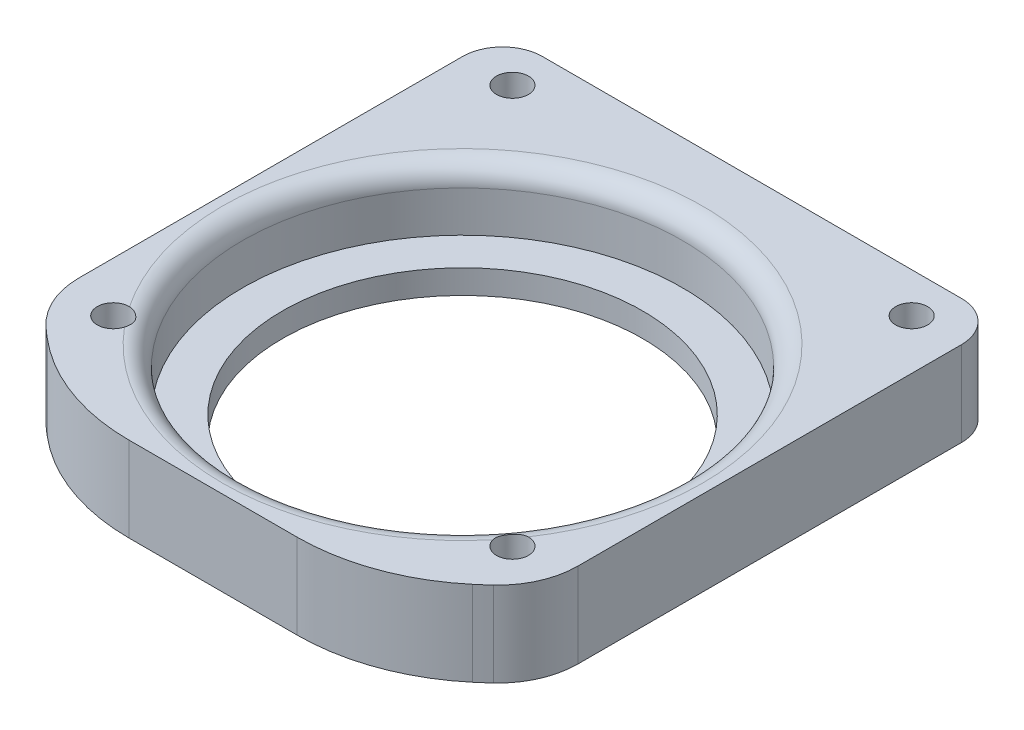
ISO-10303-21;
HEADER;
FILE_DESCRIPTION(('STEP AP214'),'2;1');
FILE_NAME('part.step','',(''),(''),'','','');
FILE_SCHEMA(('AUTOMOTIVE_DESIGN { 1 0 10303 214 1 1 1 1 }'));
ENDSEC;
DATA;
#1=APPLICATION_CONTEXT('core data for automotive mechanical design processes');
#2=APPLICATION_PROTOCOL_DEFINITION('international standard','automotive_design',2000,#1);
#3=PRODUCT_CONTEXT('',#1,'mechanical');
#4=PRODUCT('Part','Part','',(#3));
#5=PRODUCT_RELATED_PRODUCT_CATEGORY('part','',(#4));
#6=PRODUCT_DEFINITION_FORMATION('','',#4);
#7=PRODUCT_DEFINITION_CONTEXT('part definition',#1,'design');
#8=PRODUCT_DEFINITION('design','',#6,#7);
#9=PRODUCT_DEFINITION_SHAPE('','',#8);
#10=(LENGTH_UNIT() NAMED_UNIT(*) SI_UNIT(.MILLI.,.METRE.));
#11=(NAMED_UNIT(*) PLANE_ANGLE_UNIT() SI_UNIT($,.RADIAN.));
#12=(NAMED_UNIT(*) SI_UNIT($,.STERADIAN.) SOLID_ANGLE_UNIT());
#13=UNCERTAINTY_MEASURE_WITH_UNIT(LENGTH_MEASURE(1.E-05),#10,'distance_accuracy_value','');
#14=(GEOMETRIC_REPRESENTATION_CONTEXT(3) GLOBAL_UNCERTAINTY_ASSIGNED_CONTEXT((#13)) GLOBAL_UNIT_ASSIGNED_CONTEXT((#10,
#11,#12)) REPRESENTATION_CONTEXT('',''));
#15=CARTESIAN_POINT('',(0.,0.,0.));
#16=DIRECTION('',(0.,0.,1.));
#17=DIRECTION('',(1.,0.,0.));
#18=AXIS2_PLACEMENT_3D('',#15,#16,#17);
#19=CARTESIAN_POINT('',(0.,8.5,0.));
#20=DIRECTION('',(0.,1.,0.));
#21=DIRECTION('',(0.,0.,1.));
#22=AXIS2_PLACEMENT_3D('',#19,#20,#21);
#23=PLANE('',#22);
#24=CARTESIAN_POINT('',(20.0000000000001,8.5,15.0000000000005));
#25=DIRECTION('',(0.,1.,0.));
#26=DIRECTION('',(0.,0.,1.));
#27=AXIS2_PLACEMENT_3D('',#24,#25,#26);
#28=CIRCLE('',#27,1.6);
#29=CARTESIAN_POINT('',(18.45609648559,8.5,15.41995468588));
#30=VERTEX_POINT('',#29);
#31=CARTESIAN_POINT('',(19.9708635144096,8.5,13.4002653141205));
#32=VERTEX_POINT('',#31);
#33=EDGE_CURVE('E183',#30,#32,#28,.T.);
#34=ORIENTED_EDGE('',*,*,#33,.F.);
#35=CARTESIAN_POINT('',(0.,8.5,0.));
#36=DIRECTION('',(0.,1.,0.));
#37=DIRECTION('',(0.,0.,1.));
#38=AXIS2_PLACEMENT_3D('',#35,#36,#37);
#39=CIRCLE('',#38,24.05);
#40=CARTESIAN_POINT('',(-18.45609648559,8.5,15.41995468588));
#41=VERTEX_POINT('',#40);
#42=EDGE_CURVE('E193',#30,#41,#39,.F.);
#43=ORIENTED_EDGE('',*,*,#42,.T.);
#44=CARTESIAN_POINT('',(-20.,8.5,15.));
#45=DIRECTION('',(0.,1.,0.));
#46=DIRECTION('',(0.,0.,1.));
#47=AXIS2_PLACEMENT_3D('',#44,#45,#46);
#48=CIRCLE('',#47,1.6);
#49=CARTESIAN_POINT('',(-19.97086351441,8.5,13.40026531412));
#50=VERTEX_POINT('',#49);
#51=EDGE_CURVE('E664',#50,#41,#48,.T.);
#52=ORIENTED_EDGE('',*,*,#51,.F.);
#53=EDGE_CURVE('E195',#50,#32,#39,.F.);
#54=ORIENTED_EDGE('',*,*,#53,.T.);
#55=EDGE_LOOP('',(#34,#43,#52,#54));
#56=FACE_BOUND('',#55,.T.);
#57=CARTESIAN_POINT('',(-19.9999999999996,8.5,-24.9999999999998));
#58=DIRECTION('',(0.,1.,0.));
#59=DIRECTION('',(0.,0.,1.));
#60=AXIS2_PLACEMENT_3D('',#57,#58,#59);
#61=CIRCLE('',#60,1.6);
#62=CARTESIAN_POINT('',(-19.9999999999996,8.5,-23.3999999999998));
#63=VERTEX_POINT('',#62);
#64=EDGE_CURVE('E710',#63,#63,#61,.T.);
#65=ORIENTED_EDGE('',*,*,#64,.F.);
#66=EDGE_LOOP('',(#65));
#67=FACE_BOUND('',#66,.T.);
#68=CARTESIAN_POINT('',(20.0000000000004,8.5,-24.9999999999996));
#69=DIRECTION('',(0.,1.,0.));
#70=DIRECTION('',(0.,0.,1.));
#71=AXIS2_PLACEMENT_3D('',#68,#69,#70);
#72=CIRCLE('',#71,1.6);
#73=CARTESIAN_POINT('',(20.0000000000004,8.5,-23.3999999999996));
#74=VERTEX_POINT('',#73);
#75=EDGE_CURVE('E719',#74,#74,#72,.T.);
#76=ORIENTED_EDGE('',*,*,#75,.F.);
#77=EDGE_LOOP('',(#76));
#78=FACE_BOUND('',#77,.T.);
#79=DIRECTION('',(-1.,0.,0.));
#80=VECTOR('',#79,1.);
#81=CARTESIAN_POINT('',(0.,8.5,25.));
#82=LINE('',#81,#80);
#83=CARTESIAN_POINT('',(8.42485824974702,8.5,25.));
#84=VERTEX_POINT('',#83);
#85=CARTESIAN_POINT('',(-8.42485824974702,8.5,25.));
#86=VERTEX_POINT('',#85);
#87=EDGE_CURVE('E265',#84,#86,#82,.T.);
#88=ORIENTED_EDGE('',*,*,#87,.F.);
#89=CARTESIAN_POINT('',(8.42485824974702,8.5,5.));
#90=DIRECTION('',(0.,1.,0.));
#91=DIRECTION('',(0.,0.,1.));
#92=AXIS2_PLACEMENT_3D('',#89,#90,#91);
#93=CIRCLE('',#92,20.);
#94=CARTESIAN_POINT('',(21.310978549613,8.5,20.2953556224556));
#95=VERTEX_POINT('',#94);
#96=EDGE_CURVE('E86',#84,#95,#93,.T.);
#97=ORIENTED_EDGE('',*,*,#96,.T.);
#98=CARTESIAN_POINT('',(0.,8.5,-5.));
#99=DIRECTION('',(0.,1.,0.));
#100=DIRECTION('',(0.,0.,1.));
#101=AXIS2_PLACEMENT_3D('',#98,#99,#100);
#102=CIRCLE('',#101,33.0758646570057);
#103=CARTESIAN_POINT('',(22.4235417944802,8.5,19.3145552334349));
#104=VERTEX_POINT('',#103);
#105=EDGE_CURVE('E263',#95,#104,#102,.T.);
#106=ORIENTED_EDGE('',*,*,#105,.T.);
#107=CARTESIAN_POINT('',(17.,8.5,13.4336374136107));
#108=DIRECTION('',(0.,1.,0.));
#109=DIRECTION('',(0.,0.,1.));
#110=AXIS2_PLACEMENT_3D('',#107,#108,#109);
#111=CIRCLE('',#110,8.);
#112=CARTESIAN_POINT('',(25.,8.5,13.4336374136107));
#113=VERTEX_POINT('',#112);
#114=EDGE_CURVE('E235',#104,#113,#111,.T.);
#115=ORIENTED_EDGE('',*,*,#114,.T.);
#116=DIRECTION('',(0.,0.,-1.));
#117=VECTOR('',#116,1.);
#118=CARTESIAN_POINT('',(25.,8.5,0.));
#119=LINE('',#118,#117);
#120=CARTESIAN_POINT('',(25.,8.5,-25.));
#121=VERTEX_POINT('',#120);
#122=EDGE_CURVE('E287',#113,#121,#119,.T.);
#123=ORIENTED_EDGE('',*,*,#122,.T.);
#124=CARTESIAN_POINT('',(21.,8.5,-25.));
#125=DIRECTION('',(0.,1.,0.));
#126=DIRECTION('',(0.,0.,1.));
#127=AXIS2_PLACEMENT_3D('',#124,#125,#126);
#128=CIRCLE('',#127,4.);
#129=CARTESIAN_POINT('',(21.,8.5,-29.));
#130=VERTEX_POINT('',#129);
#131=EDGE_CURVE('E225',#121,#130,#128,.T.);
#132=ORIENTED_EDGE('',*,*,#131,.T.);
#133=DIRECTION('',(1.,0.,0.));
#134=VECTOR('',#133,1.);
#135=CARTESIAN_POINT('',(0.,8.5,-29.));
#136=LINE('',#135,#134);
#137=CARTESIAN_POINT('',(-21.,8.5,-29.));
#138=VERTEX_POINT('',#137);
#139=EDGE_CURVE('E678',#138,#130,#136,.T.);
#140=ORIENTED_EDGE('',*,*,#139,.F.);
#141=CARTESIAN_POINT('',(-21.,8.5,-25.));
#142=DIRECTION('',(0.,1.,0.));
#143=DIRECTION('',(0.,0.,1.));
#144=AXIS2_PLACEMENT_3D('',#141,#142,#143);
#145=CIRCLE('',#144,4.);
#146=CARTESIAN_POINT('',(-25.,8.5,-25.));
#147=VERTEX_POINT('',#146);
#148=EDGE_CURVE('E222',#138,#147,#145,.T.);
#149=ORIENTED_EDGE('',*,*,#148,.T.);
#150=DIRECTION('',(0.,0.,-1.));
#151=VECTOR('',#150,1.);
#152=CARTESIAN_POINT('',(-25.,8.5,0.));
#153=LINE('',#152,#151);
#154=CARTESIAN_POINT('',(-25.,8.5,13.4336374136107));
#155=VERTEX_POINT('',#154);
#156=EDGE_CURVE('E293',#155,#147,#153,.T.);
#157=ORIENTED_EDGE('',*,*,#156,.F.);
#158=CARTESIAN_POINT('',(-17.,8.5,13.4336374136107));
#159=DIRECTION('',(0.,1.,0.));
#160=DIRECTION('',(0.,0.,1.));
#161=AXIS2_PLACEMENT_3D('',#158,#159,#160);
#162=CIRCLE('',#161,8.);
#163=CARTESIAN_POINT('',(-22.4235417944802,8.5,19.3145552334349));
#164=VERTEX_POINT('',#163);
#165=EDGE_CURVE('E233',#155,#164,#162,.T.);
#166=ORIENTED_EDGE('',*,*,#165,.T.);
#167=CARTESIAN_POINT('',(0.,8.5,-5.));
#168=DIRECTION('',(0.,1.,0.));
#169=DIRECTION('',(0.,0.,1.));
#170=AXIS2_PLACEMENT_3D('',#167,#168,#169);
#171=CIRCLE('',#170,33.0758646570057);
#172=CARTESIAN_POINT('',(-21.310978549613,8.5,20.2953556224556));
#173=VERTEX_POINT('',#172);
#174=EDGE_CURVE('E646',#164,#173,#171,.T.);
#175=ORIENTED_EDGE('',*,*,#174,.T.);
#176=CARTESIAN_POINT('',(-8.42485824974702,8.5,5.));
#177=DIRECTION('',(0.,1.,0.));
#178=DIRECTION('',(0.,0.,1.));
#179=AXIS2_PLACEMENT_3D('',#176,#177,#178);
#180=CIRCLE('',#179,20.);
#181=EDGE_CURVE('E98',#173,#86,#180,.T.);
#182=ORIENTED_EDGE('',*,*,#181,.T.);
#183=EDGE_LOOP('',(#88,#97,#106,#115,#123,#132,#140,#149,#157,#166,#175,#182));
#184=FACE_BOUND('',#183,.T.);
#185=ADVANCED_FACE('F78',(#56,#67,#78,#184),#23,.T.);
#186=CARTESIAN_POINT('',(0.,0.,0.));
#187=DIRECTION('',(0.,1.,0.));
#188=DIRECTION('',(0.,0.,1.));
#189=AXIS2_PLACEMENT_3D('',#186,#187,#188);
#190=PLANE('',#189);
#191=CARTESIAN_POINT('',(20.0000000000001,0.,15.0000000000005));
#192=DIRECTION('',(0.,-1.,0.));
#193=DIRECTION('',(0.,0.,-1.));
#194=AXIS2_PLACEMENT_3D('',#191,#192,#193);
#195=CIRCLE('',#194,3.2);
#196=CARTESIAN_POINT('',(20.0000000000001,0.,11.8000000000005));
#197=VERTEX_POINT('',#196);
#198=EDGE_CURVE('E656',#197,#197,#195,.T.);
#199=ORIENTED_EDGE('',*,*,#198,.F.);
#200=EDGE_LOOP('',(#199));
#201=FACE_BOUND('',#200,.T.);
#202=CARTESIAN_POINT('',(20.0000000000004,0.,-24.9999999999996));
#203=DIRECTION('',(0.,-1.,0.));
#204=DIRECTION('',(0.,0.,-1.));
#205=AXIS2_PLACEMENT_3D('',#202,#203,#204);
#206=CIRCLE('',#205,3.2);
#207=CARTESIAN_POINT('',(20.0000000000004,0.,-28.1999999999996));
#208=VERTEX_POINT('',#207);
#209=EDGE_CURVE('E668',#208,#208,#206,.T.);
#210=ORIENTED_EDGE('',*,*,#209,.F.);
#211=EDGE_LOOP('',(#210));
#212=FACE_BOUND('',#211,.T.);
#213=CARTESIAN_POINT('',(-19.9999999999996,0.,-24.9999999999998));
#214=DIRECTION('',(0.,-1.,0.));
#215=DIRECTION('',(0.,0.,-1.));
#216=AXIS2_PLACEMENT_3D('',#213,#214,#215);
#217=CIRCLE('',#216,3.2);
#218=CARTESIAN_POINT('',(-19.9999999999996,0.,-28.1999999999998));
#219=VERTEX_POINT('',#218);
#220=EDGE_CURVE('E674',#219,#219,#217,.T.);
#221=ORIENTED_EDGE('',*,*,#220,.F.);
#222=EDGE_LOOP('',(#221));
#223=FACE_BOUND('',#222,.T.);
#224=CARTESIAN_POINT('',(-20.,0.,15.));
#225=DIRECTION('',(0.,-1.,0.));
#226=DIRECTION('',(0.,0.,-1.));
#227=AXIS2_PLACEMENT_3D('',#224,#225,#226);
#228=CIRCLE('',#227,3.2);
#229=CARTESIAN_POINT('',(-20.,0.,11.8));
#230=VERTEX_POINT('',#229);
#231=EDGE_CURVE('E655',#230,#230,#228,.T.);
#232=ORIENTED_EDGE('',*,*,#231,.F.);
#233=EDGE_LOOP('',(#232));
#234=FACE_BOUND('',#233,.T.);
#235=CARTESIAN_POINT('',(0.,0.,0.));
#236=DIRECTION('',(0.,1.,0.));
#237=DIRECTION('',(0.,0.,1.));
#238=AXIS2_PLACEMENT_3D('',#235,#236,#237);
#239=CIRCLE('',#238,18.05);
#240=CARTESIAN_POINT('',(0.,0.,18.05));
#241=VERTEX_POINT('',#240);
#242=EDGE_CURVE('E299',#241,#241,#239,.T.);
#243=ORIENTED_EDGE('',*,*,#242,.T.);
#244=EDGE_LOOP('',(#243));
#245=FACE_BOUND('',#244,.T.);
#246=CARTESIAN_POINT('',(0.,0.,-5.));
#247=DIRECTION('',(0.,-1.,0.));
#248=DIRECTION('',(0.,0.,-1.));
#249=AXIS2_PLACEMENT_3D('',#246,#247,#248);
#250=CIRCLE('',#249,33.0758646570057);
#251=CARTESIAN_POINT('',(22.4235417944802,0.,19.3145552334349));
#252=VERTEX_POINT('',#251);
#253=CARTESIAN_POINT('',(21.310978549613,0.,20.2953556224556));
#254=VERTEX_POINT('',#253);
#255=EDGE_CURVE('E275',#252,#254,#250,.T.);
#256=ORIENTED_EDGE('',*,*,#255,.T.);
#257=CARTESIAN_POINT('',(8.42485824974702,0.,5.));
#258=DIRECTION('',(0.,1.,0.));
#259=DIRECTION('',(0.,0.,1.));
#260=AXIS2_PLACEMENT_3D('',#257,#258,#259);
#261=CIRCLE('',#260,20.);
#262=CARTESIAN_POINT('',(8.42485824974702,0.,25.));
#263=VERTEX_POINT('',#262);
#264=EDGE_CURVE('E254',#254,#263,#261,.F.);
#265=ORIENTED_EDGE('',*,*,#264,.T.);
#266=DIRECTION('',(-1.,0.,0.));
#267=VECTOR('',#266,1.);
#268=CARTESIAN_POINT('',(0.,0.,25.));
#269=LINE('',#268,#267);
#270=CARTESIAN_POINT('',(-8.42485824974702,0.,25.));
#271=VERTEX_POINT('',#270);
#272=EDGE_CURVE('E282',#263,#271,#269,.T.);
#273=ORIENTED_EDGE('',*,*,#272,.T.);
#274=CARTESIAN_POINT('',(-8.42485824974702,0.,5.));
#275=DIRECTION('',(0.,1.,0.));
#276=DIRECTION('',(0.,0.,1.));
#277=AXIS2_PLACEMENT_3D('',#274,#275,#276);
#278=CIRCLE('',#277,20.);
#279=CARTESIAN_POINT('',(-21.310978549613,0.,20.2953556224556));
#280=VERTEX_POINT('',#279);
#281=EDGE_CURVE('E252',#271,#280,#278,.F.);
#282=ORIENTED_EDGE('',*,*,#281,.T.);
#283=CARTESIAN_POINT('',(0.,0.,-5.));
#284=DIRECTION('',(0.,-1.,0.));
#285=DIRECTION('',(0.,0.,-1.));
#286=AXIS2_PLACEMENT_3D('',#283,#284,#285);
#287=CIRCLE('',#286,33.0758646570057);
#288=CARTESIAN_POINT('',(-22.4235417944802,0.,19.3145552334349));
#289=VERTEX_POINT('',#288);
#290=EDGE_CURVE('E274',#280,#289,#287,.T.);
#291=ORIENTED_EDGE('',*,*,#290,.T.);
#292=CARTESIAN_POINT('',(-17.,0.,13.4336374136107));
#293=DIRECTION('',(0.,1.,0.));
#294=DIRECTION('',(0.,0.,1.));
#295=AXIS2_PLACEMENT_3D('',#292,#293,#294);
#296=CIRCLE('',#295,8.);
#297=CARTESIAN_POINT('',(-25.,0.,13.4336374136107));
#298=VERTEX_POINT('',#297);
#299=EDGE_CURVE('E239',#289,#298,#296,.F.);
#300=ORIENTED_EDGE('',*,*,#299,.T.);
#301=DIRECTION('',(0.,0.,-1.));
#302=VECTOR('',#301,1.);
#303=CARTESIAN_POINT('',(-25.,0.,0.));
#304=LINE('',#303,#302);
#305=CARTESIAN_POINT('',(-25.,0.,-25.));
#306=VERTEX_POINT('',#305);
#307=EDGE_CURVE('E286',#298,#306,#304,.T.);
#308=ORIENTED_EDGE('',*,*,#307,.T.);
#309=CARTESIAN_POINT('',(-21.,0.,-25.));
#310=DIRECTION('',(0.,1.,0.));
#311=DIRECTION('',(0.,0.,1.));
#312=AXIS2_PLACEMENT_3D('',#309,#310,#311);
#313=CIRCLE('',#312,4.);
#314=CARTESIAN_POINT('',(-21.,0.,-29.));
#315=VERTEX_POINT('',#314);
#316=EDGE_CURVE('E214',#306,#315,#313,.F.);
#317=ORIENTED_EDGE('',*,*,#316,.T.);
#318=DIRECTION('',(1.,0.,0.));
#319=VECTOR('',#318,1.);
#320=CARTESIAN_POINT('',(0.,0.,-29.));
#321=LINE('',#320,#319);
#322=CARTESIAN_POINT('',(21.,0.,-29.));
#323=VERTEX_POINT('',#322);
#324=EDGE_CURVE('E682',#315,#323,#321,.T.);
#325=ORIENTED_EDGE('',*,*,#324,.T.);
#326=CARTESIAN_POINT('',(21.,0.,-25.));
#327=DIRECTION('',(0.,1.,0.));
#328=DIRECTION('',(0.,0.,1.));
#329=AXIS2_PLACEMENT_3D('',#326,#327,#328);
#330=CIRCLE('',#329,4.);
#331=CARTESIAN_POINT('',(25.,0.,-25.));
#332=VERTEX_POINT('',#331);
#333=EDGE_CURVE('E216',#323,#332,#330,.F.);
#334=ORIENTED_EDGE('',*,*,#333,.T.);
#335=DIRECTION('',(0.,0.,-1.));
#336=VECTOR('',#335,1.);
#337=CARTESIAN_POINT('',(25.,0.,0.));
#338=LINE('',#337,#336);
#339=CARTESIAN_POINT('',(25.,0.,13.4336374136107));
#340=VERTEX_POINT('',#339);
#341=EDGE_CURVE('E290',#340,#332,#338,.T.);
#342=ORIENTED_EDGE('',*,*,#341,.F.);
#343=CARTESIAN_POINT('',(17.,0.,13.4336374136107));
#344=DIRECTION('',(0.,1.,0.));
#345=DIRECTION('',(0.,0.,1.));
#346=AXIS2_PLACEMENT_3D('',#343,#344,#345);
#347=CIRCLE('',#346,8.);
#348=EDGE_CURVE('E241',#340,#252,#347,.F.);
#349=ORIENTED_EDGE('',*,*,#348,.T.);
#350=EDGE_LOOP('',(#256,#265,#273,#282,#291,#300,#308,#317,#325,#334,#342,#349));
#351=FACE_BOUND('',#350,.T.);
#352=ADVANCED_FACE('F281',(#201,#212,#223,#234,#245,#351),#190,.F.);
#353=CARTESIAN_POINT('',(0.,8.5,25.));
#354=DIRECTION('',(0.,0.,1.));
#355=DIRECTION('',(1.,0.,0.));
#356=AXIS2_PLACEMENT_3D('',#353,#354,#355);
#357=PLANE('',#356);
#358=ORIENTED_EDGE('',*,*,#272,.F.);
#359=DIRECTION('',(0.,-1.,0.));
#360=VECTOR('',#359,1.);
#361=CARTESIAN_POINT('',(8.42485824974702,8.5,25.));
#362=LINE('',#361,#360);
#363=EDGE_CURVE('E259',#263,#84,#362,.F.);
#364=ORIENTED_EDGE('',*,*,#363,.T.);
#365=ORIENTED_EDGE('',*,*,#87,.T.);
#366=DIRECTION('',(0.,-1.,0.));
#367=VECTOR('',#366,1.);
#368=CARTESIAN_POINT('',(-8.42485824974702,8.5,25.));
#369=LINE('',#368,#367);
#370=EDGE_CURVE('E256',#86,#271,#369,.T.);
#371=ORIENTED_EDGE('',*,*,#370,.T.);
#372=EDGE_LOOP('',(#358,#364,#365,#371));
#373=FACE_BOUND('',#372,.T.);
#374=ADVANCED_FACE('F284',(#373),#357,.T.);
#375=CARTESIAN_POINT('',(25.,8.5,0.));
#376=DIRECTION('',(-1.,0.,0.));
#377=DIRECTION('',(0.,0.,1.));
#378=AXIS2_PLACEMENT_3D('',#375,#376,#377);
#379=PLANE('',#378);
#380=ORIENTED_EDGE('',*,*,#122,.F.);
#381=DIRECTION('',(0.,1.,0.));
#382=VECTOR('',#381,1.);
#383=CARTESIAN_POINT('',(25.,0.,13.4336374136107));
#384=LINE('',#383,#382);
#385=EDGE_CURVE('E237',#113,#340,#384,.F.);
#386=ORIENTED_EDGE('',*,*,#385,.T.);
#387=ORIENTED_EDGE('',*,*,#341,.T.);
#388=DIRECTION('',(0.,-1.,0.));
#389=VECTOR('',#388,1.);
#390=CARTESIAN_POINT('',(25.,8.5,-25.));
#391=LINE('',#390,#389);
#392=EDGE_CURVE('E219',#332,#121,#391,.F.);
#393=ORIENTED_EDGE('',*,*,#392,.T.);
#394=EDGE_LOOP('',(#380,#386,#387,#393));
#395=FACE_BOUND('',#394,.T.);
#396=ADVANCED_FACE('F318',(#395),#379,.F.);
#397=CARTESIAN_POINT('',(-25.,8.5,0.));
#398=DIRECTION('',(-1.,0.,0.));
#399=DIRECTION('',(0.,0.,1.));
#400=AXIS2_PLACEMENT_3D('',#397,#398,#399);
#401=PLANE('',#400);
#402=ORIENTED_EDGE('',*,*,#307,.F.);
#403=DIRECTION('',(0.,-1.,0.));
#404=VECTOR('',#403,1.);
#405=CARTESIAN_POINT('',(-25.,8.5,13.4336374136107));
#406=LINE('',#405,#404);
#407=EDGE_CURVE('E243',#298,#155,#406,.F.);
#408=ORIENTED_EDGE('',*,*,#407,.T.);
#409=ORIENTED_EDGE('',*,*,#156,.T.);
#410=DIRECTION('',(0.,-1.,0.));
#411=VECTOR('',#410,1.);
#412=CARTESIAN_POINT('',(-25.,8.5,-25.));
#413=LINE('',#412,#411);
#414=EDGE_CURVE('E227',#147,#306,#413,.T.);
#415=ORIENTED_EDGE('',*,*,#414,.T.);
#416=EDGE_LOOP('',(#402,#408,#409,#415));
#417=FACE_BOUND('',#416,.T.);
#418=ADVANCED_FACE('F308',(#417),#401,.T.);
#419=CARTESIAN_POINT('',(0.,2.4,0.));
#420=DIRECTION('',(0.,1.,0.));
#421=DIRECTION('',(0.,0.,1.));
#422=AXIS2_PLACEMENT_3D('',#419,#420,#421);
#423=CYLINDRICAL_SURFACE('',#422,22.05);
#424=CARTESIAN_POINT('',(0.,6.5,0.));
#425=DIRECTION('',(0.,1.,0.));
#426=DIRECTION('',(0.,0.,1.));
#427=AXIS2_PLACEMENT_3D('',#424,#425,#426);
#428=CIRCLE('',#427,22.05);
#429=CARTESIAN_POINT('',(0.,6.5,22.05));
#430=VERTEX_POINT('',#429);
#431=EDGE_CURVE('E202',#430,#430,#428,.T.);
#432=ORIENTED_EDGE('',*,*,#431,.T.);
#433=EDGE_LOOP('',(#432));
#434=FACE_BOUND('',#433,.T.);
#435=CARTESIAN_POINT('',(0.,2.4,0.));
#436=DIRECTION('',(0.,1.,0.));
#437=DIRECTION('',(0.,0.,1.));
#438=AXIS2_PLACEMENT_3D('',#435,#436,#437);
#439=CIRCLE('',#438,22.05);
#440=CARTESIAN_POINT('',(0.,2.4,22.05));
#441=VERTEX_POINT('',#440);
#442=EDGE_CURVE('E206',#441,#441,#439,.T.);
#443=ORIENTED_EDGE('',*,*,#442,.F.);
#444=EDGE_LOOP('',(#443));
#445=FACE_BOUND('',#444,.T.);
#446=ADVANCED_FACE('F306',(#434,#445),#423,.F.);
#447=CARTESIAN_POINT('',(0.,2.4,0.));
#448=DIRECTION('',(0.,1.,0.));
#449=DIRECTION('',(0.,0.,1.));
#450=AXIS2_PLACEMENT_3D('',#447,#448,#449);
#451=PLANE('',#450);
#452=CARTESIAN_POINT('',(0.,2.4,0.));
#453=DIRECTION('',(0.,1.,0.));
#454=DIRECTION('',(0.,0.,1.));
#455=AXIS2_PLACEMENT_3D('',#452,#453,#454);
#456=CIRCLE('',#455,18.05);
#457=CARTESIAN_POINT('',(0.,2.4,18.05));
#458=VERTEX_POINT('',#457);
#459=EDGE_CURVE('E296',#458,#458,#456,.T.);
#460=ORIENTED_EDGE('',*,*,#459,.F.);
#461=EDGE_LOOP('',(#460));
#462=FACE_BOUND('',#461,.T.);
#463=ORIENTED_EDGE('',*,*,#442,.T.);
#464=EDGE_LOOP('',(#463));
#465=FACE_BOUND('',#464,.T.);
#466=ADVANCED_FACE('F304',(#462,#465),#451,.T.);
#467=CARTESIAN_POINT('',(0.,-10.1,0.));
#468=DIRECTION('',(0.,1.,0.));
#469=DIRECTION('',(0.,0.,1.));
#470=AXIS2_PLACEMENT_3D('',#467,#468,#469);
#471=CYLINDRICAL_SURFACE('',#470,18.05);
#472=ORIENTED_EDGE('',*,*,#459,.T.);
#473=EDGE_LOOP('',(#472));
#474=FACE_BOUND('',#473,.T.);
#475=ORIENTED_EDGE('',*,*,#242,.F.);
#476=EDGE_LOOP('',(#475));
#477=FACE_BOUND('',#476,.T.);
#478=ADVANCED_FACE('F315',(#474,#477),#471,.F.);
#479=CARTESIAN_POINT('',(0.,6.5,0.));
#480=DIRECTION('',(0.,1.,0.));
#481=DIRECTION('',(0.,0.,1.));
#482=AXIS2_PLACEMENT_3D('',#479,#480,#481);
#483=TOROIDAL_SURFACE('',#482,24.05,2.);
#484=CARTESIAN_POINT('',(21.5558900481153,6.4998,14.6268965851462));
#485=CARTESIAN_POINT('',(21.5558798236436,6.54802132636815,14.6269399752803));
#486=CARTESIAN_POINT('',(21.5553428541082,6.59622162087325,14.6246152538236));
#487=CARTESIAN_POINT('',(21.5531303911519,6.69209310412435,14.6155202682279));
#488=CARTESIAN_POINT('',(21.5514568843235,6.73976506882953,14.6087577617393));
#489=CARTESIAN_POINT('',(21.5469093572714,6.83379900711496,14.5911630230467));
#490=CARTESIAN_POINT('',(21.5440473085025,6.88016925404505,14.5803714793406));
#491=CARTESIAN_POINT('',(21.5369760309446,6.97181564227416,14.5551661476164));
#492=CARTESIAN_POINT('',(21.5327661285746,7.01709122432839,14.5407505492759));
#493=CARTESIAN_POINT('',(21.5157235611769,7.17006205479962,14.4859682982186));
#494=CARTESIAN_POINT('',(21.4991574665076,7.27466360401745,14.4379177024467));
#495=CARTESIAN_POINT('',(21.4541084012937,7.47523988466989,14.3299212838286));
#496=CARTESIAN_POINT('',(21.4255656157848,7.57116833591533,14.269916559933));
#497=CARTESIAN_POINT('',(21.3530731781622,7.75418622848509,14.1428947717347));
#498=CARTESIAN_POINT('',(21.3089203338468,7.84113854666276,14.0757938288432));
#499=CARTESIAN_POINT('',(21.2024733169052,8.00235383378343,13.9410515435239));
#500=CARTESIAN_POINT('',(21.1402525367794,8.07666624718232,13.8734134433446));
#501=CARTESIAN_POINT('',(21.0194736353217,8.18797444853678,13.7651105163419));
#502=CARTESIAN_POINT('',(20.9663024185894,8.22924733709921,13.7228260524567));
#503=CARTESIAN_POINT('',(20.8510854694685,8.30354431941114,13.6433361986907));
#504=CARTESIAN_POINT('',(20.7890455984659,8.33657382202089,13.606127485686));
#505=CARTESIAN_POINT('',(20.6567562265701,8.39364811176422,13.5391120717753));
#506=CARTESIAN_POINT('',(20.5864632210984,8.4176422001673,13.5093474445314));
#507=CARTESIAN_POINT('',(20.4400149029458,8.45614343786593,13.4597545574446));
#508=CARTESIAN_POINT('',(20.3638606679776,8.47065232658314,13.4399244759337));
#509=CARTESIAN_POINT('',(20.2150379357317,8.49006888543556,13.4128672430994));
#510=CARTESIAN_POINT('',(20.1426265371231,8.49569021659616,13.4047090302206));
#511=CARTESIAN_POINT('',(19.997171324985,8.50086363597077,13.3983460908069));
#512=CARTESIAN_POINT('',(19.9241273736475,8.50041436661534,13.4001435906167));
#513=CARTESIAN_POINT('',(19.7751388090084,8.49490296999057,13.4140165310139));
#514=CARTESIAN_POINT('',(19.6992576143963,8.48958672922523,13.4266557202838));
#515=CARTESIAN_POINT('',(19.5503163361455,8.47605960300501,13.4625789791139));
#516=CARTESIAN_POINT('',(19.4772581735674,8.46784678363354,13.4858701636274));
#517=CARTESIAN_POINT('',(19.3257214467944,8.44944460533416,13.5464291911462));
#518=CARTESIAN_POINT('',(19.2478365670871,8.43913799162352,13.5851561405453));
#519=CARTESIAN_POINT('',(19.0991998257722,8.42029838461487,13.6748235468502));
#520=CARTESIAN_POINT('',(19.0284480439288,8.41176541114905,13.7257641403108));
#521=CARTESIAN_POINT('',(18.8936068862985,8.39852143651014,13.8406884806356));
#522=CARTESIAN_POINT('',(18.8298359369667,8.39395411339417,13.9050651682527));
#523=CARTESIAN_POINT('',(18.7140332572077,8.39050506767066,14.0437348248044));
#524=CARTESIAN_POINT('',(18.6619967470876,8.39162102575466,14.1180237365768));
#525=CARTESIAN_POINT('',(18.5739362320661,8.39897130208947,14.2695371398283));
#526=CARTESIAN_POINT('',(18.5371583114023,8.40490487443074,14.3463411802908));
#527=CARTESIAN_POINT('',(18.4762829884119,8.41997289266309,14.5045430131998));
#528=CARTESIAN_POINT('',(18.4521925032138,8.42910908009313,14.5859432847701));
#529=CARTESIAN_POINT('',(18.4165271526889,8.44862443964821,14.7544408889862));
#530=CARTESIAN_POINT('',(18.4054407420062,8.45903679045368,14.8416377266664));
#531=CARTESIAN_POINT('',(18.3976860908393,8.47781190411793,15.0169340140538));
#532=CARTESIAN_POINT('',(18.4010212467312,8.48617418368109,15.1050336715069));
#533=CARTESIAN_POINT('',(18.4224481602892,8.49780180460089,15.2818213052705));
#534=CARTESIAN_POINT('',(18.4408634116273,8.50095079290844,15.3704794801498));
#535=CARTESIAN_POINT('',(18.4923716066432,8.49854490552776,15.5432779431242));
#536=CARTESIAN_POINT('',(18.5254429948083,8.493002782015,15.6274246634499));
#537=CARTESIAN_POINT('',(18.5996597070282,8.47216136386049,15.7779517539933));
#538=CARTESIAN_POINT('',(18.6393162751825,8.45814283917181,15.8452451692012));
#539=CARTESIAN_POINT('',(18.7264958360683,8.4207939391308,15.9716351732557));
#540=CARTESIAN_POINT('',(18.774016484345,8.39746633610245,16.0307341954091));
#541=CARTESIAN_POINT('',(18.8702601627254,8.34392272055528,16.1350450986656));
#542=CARTESIAN_POINT('',(18.918586920684,8.31440218472621,16.1809876612943));
#543=CARTESIAN_POINT('',(19.0175532330265,8.24830546244921,16.2645148516022));
#544=CARTESIAN_POINT('',(19.0681938756401,8.21172592950656,16.3020954968387));
#545=CARTESIAN_POINT('',(19.1877361475539,8.11845571903098,16.3809388599785));
#546=CARTESIAN_POINT('',(19.2568265674387,8.05920683836076,16.4188878906001));
#547=CARTESIAN_POINT('',(19.3921750537209,7.93138858250512,16.4819401709605));
#548=CARTESIAN_POINT('',(19.4584284628619,7.86280459992766,16.5070229885735));
#549=CARTESIAN_POINT('',(19.5863062080197,7.71658027370535,16.5470675924104));
#550=CARTESIAN_POINT('',(19.6478302731341,7.63880343526331,16.5618462080723));
#551=CARTESIAN_POINT('',(19.7622456253007,7.47605828049778,16.583307135448));
#552=CARTESIAN_POINT('',(19.8151323058164,7.39108616319271,16.5899851390227));
#553=CARTESIAN_POINT('',(19.9082865318448,7.21619883041846,16.5980399081565));
#554=CARTESIAN_POINT('',(19.9487670400967,7.12640233690109,16.5995113287124));
#555=CARTESIAN_POINT('',(20.0146483261625,6.94156735931352,16.6002795042578));
#556=CARTESIAN_POINT('',(20.04010378339,6.84654927572304,16.5995842031836));
#557=CARTESIAN_POINT('',(20.0633349833042,6.70876279827524,16.5987594197887));
#558=CARTESIAN_POINT('',(20.0686149056556,6.66719592900685,16.5985337803261));
#559=CARTESIAN_POINT('',(20.075694036843,6.58369474875918,16.5982106431786));
#560=CARTESIAN_POINT('',(20.0774871587424,6.54175992335609,16.5981133696781));
#561=CARTESIAN_POINT('',(20.0774699352122,6.4998,16.5981234023503));
#562=B_SPLINE_CURVE_WITH_KNOTS('',3,(#484,#485,#486,#487,#488,#489,#490,#491,#492,#493,#494,
#495,#496,#497,#498,#499,#500,#501,#502,#503,#504,#505,#506,#507,#508,#509,#510,#511,#512,#513,
#514,#515,#516,#517,#518,#519,#520,#521,#522,#523,#524,#525,#526,#527,#528,#529,#530,#531,#532,
#533,#534,#535,#536,#537,#538,#539,#540,#541,#542,#543,#544,#545,#546,#547,#548,#549,#550,#551,
#552,#553,#554,#555,#556,#557,#558,#559,#560,#561),.UNSPECIFIED.,.F.,.F.,(4,2,2,2,2,2,2,2,2,2,2,
2,2,2,2,2,2,2,2,2,2,2,2,2,2,2,2,2,2,2,2,2,2,2,2,2,2,2,4),(0.,0.144570221341461,
0.288888391637893,0.431786896485903,0.574756925688928,0.92168220311575,1.27036114265615,
1.62375681155432,1.97573659067268,2.21327320271542,2.45065354398995,2.68934667933685,
2.92799603020116,3.14628038380325,3.36461355318032,3.59503951153162,3.82561960718389,
4.08723034703379,4.3488440119613,4.61958195161376,4.89020941380676,5.14513393714419,
5.40019730060087,5.66456225618692,5.92898947489066,6.19924246604894,6.46909929496484,
6.70584161358684,6.94251348085312,7.16036073764321,7.37831152523723,7.67253337002427,
7.96722101697007,8.26702203549275,8.56698242703748,8.86146073620657,9.15486065994568,
9.28043608481381,9.40623053163307),.UNSPECIFIED.);
#563=EDGE_CURVE('E179',#32,#30,#562,.T.);
#564=ORIENTED_EDGE('',*,*,#563,.F.);
#565=ORIENTED_EDGE('',*,*,#53,.F.);
#566=CARTESIAN_POINT('',(-20.0774699352126,6.4998,16.5981234023498));
#567=CARTESIAN_POINT('',(-20.0775087268893,6.54802132636814,16.5981014376194));
#568=CARTESIAN_POINT('',(-20.0751266428209,6.59622162087324,16.5982368688733));
#569=CARTESIAN_POINT('',(-20.0657759670212,6.69209310412432,16.5986595004021));
#570=CARTESIAN_POINT('',(-20.0588153788803,6.7397650688295,16.5989464356636));
#571=CARTESIAN_POINT('',(-20.0406511221608,6.83379900711492,16.5995073365275));
#572=CARTESIAN_POINT('',(-20.0294898665476,6.880169254045,16.5997814019471));
#573=CARTESIAN_POINT('',(-20.0033127903762,6.97181564227409,16.6000504683743));
#574=CARTESIAN_POINT('',(-19.9882950433057,7.01709122432831,16.6000453296344));
#575=CARTESIAN_POINT('',(-19.9309321634194,7.17006205479954,16.5990234952287));
#576=CARTESIAN_POINT('',(-19.8801650849709,7.27466360401737,16.5965742111624));
#577=CARTESIAN_POINT('',(-19.7638747848376,7.4752398846698,16.58356610577));
#578=CARTESIAN_POINT('',(-19.6982782699554,7.57116833591524,16.5729663543724));
#579=CARTESIAN_POINT('',(-19.5560394707506,7.754186228485,16.5389397149502));
#580=CARTESIAN_POINT('',(-19.4792597691665,7.84113854666267,16.515341248417));
#581=CARTESIAN_POINT('',(-19.3201020105163,8.00235383378336,16.4508799520426));
#582=CARTESIAN_POINT('',(-19.2377476159089,8.07666624718225,16.410086671172));
#583=CARTESIAN_POINT('',(-19.0999587135782,8.18797444853671,16.3244637453334));
#584=CARTESIAN_POINT('',(-19.0444776875633,8.22924733709915,16.2852590271583));
#585=CARTESIAN_POINT('',(-18.9359066821941,8.3035443194111,16.1969079150567));
#586=CARTESIAN_POINT('',(-18.8828151538288,8.33657382202085,16.1477680785355));
#587=CARTESIAN_POINT('',(-18.7814393323437,8.39364811176419,16.0395345974106));
#588=CARTESIAN_POINT('',(-18.7331832486574,8.41764220016728,15.9803874077861));
#589=CARTESIAN_POINT('',(-18.6445685479713,8.45614343786592,15.8536830307439));
#590=CARTESIAN_POINT('',(-18.6042084839298,8.47065232658313,15.7861273879975));
#591=CARTESIAN_POINT('',(-18.53656317538,8.49006888543556,15.650833590235));
#592=CARTESIAN_POINT('',(-18.5084560994059,8.49569021659616,15.5836029471769));
#593=CARTESIAN_POINT('',(-18.4616202181701,8.50086363597077,15.4457475665601));
#594=CARTESIAN_POINT('',(-18.4428935116129,8.50041436661534,15.3751220733293));
#595=CARTESIAN_POINT('',(-18.4144947362953,8.49490296999057,15.2282086279646));
#596=CARTESIAN_POINT('',(-18.405381623503,8.48958672922523,15.1518237081414));
#597=CARTESIAN_POINT('',(-18.3981643940696,8.476059603005,14.9987815685482));
#598=CARTESIAN_POINT('',(-18.4000676456806,8.46784678363352,14.9221242008095));
#599=CARTESIAN_POINT('',(-18.4157740286022,8.44944460533413,14.7596924154022));
#600=CARTESIAN_POINT('',(-18.4311441337073,8.43913799162348,14.6740793850514));
#601=CARTESIAN_POINT('',(-18.4756065561918,8.42029838461482,14.5062812396237));
#602=CARTESIAN_POINT('',(-18.5046990269978,8.41176541114899,14.4240961628851));
#603=CARTESIAN_POINT('',(-18.5772708695731,8.39852143651006,14.2624698362691));
#604=CARTESIAN_POINT('',(-18.6212166238725,8.39395411339407,14.1832242523778));
#605=CARTESIAN_POINT('',(-18.7219147438297,8.39050506767054,14.0332261759746));
#606=CARTESIAN_POINT('',(-18.7786618762975,8.39162102575453,13.962470230963));
#607=CARTESIAN_POINT('',(-18.8994577992129,8.39897130208933,13.8355083836319));
#608=CARTESIAN_POINT('',(-18.9628918602709,8.40490487443059,13.7786964484652));
#609=CARTESIAN_POINT('',(-19.0977205294263,8.41997289266294,13.6759596251798));
#610=CARTESIAN_POINT('',(-19.1691194542783,8.42910908009298,13.6300406833499));
#611=CARTESIAN_POINT('',(-19.3208908561787,8.44862443964807,13.5486226176655));
#612=CARTESIAN_POINT('',(-19.4014956253606,8.45903679045356,13.5135645488596));
#613=CARTESIAN_POINT('',(-19.5676087589256,8.47781190411783,13.4570371232709));
#614=CARTESIAN_POINT('',(-19.6531182737304,8.486174183681,13.4355709688402));
#615=CARTESIAN_POINT('',(-19.8288339379397,8.49780180460084,13.406640268402));
#616=CARTESIAN_POINT('',(-19.9191020561984,8.50095079290842,13.3994946207203));
#617=CARTESIAN_POINT('',(-20.0994108752584,8.49854490552781,13.4005589183028));
#618=CARTESIAN_POINT('',(-20.1894517154572,8.49300278201507,13.40874636925));
#619=CARTESIAN_POINT('',(-20.3547384018005,8.47216136386062,13.437846827629));
#620=CARTESIAN_POINT('',(-20.4304439194834,8.45814283917197,13.4570749767988));
#621=CARTESIAN_POINT('',(-20.5761886004238,8.42079393913102,13.5053781541139));
#622=CARTESIAN_POINT('',(-20.6462294432085,8.39746633610269,13.5344502502566));
#623=CARTESIAN_POINT('',(-20.7733161402813,8.34392272055558,13.5976371285899));
#624=CARTESIAN_POINT('',(-20.8309524926333,8.31440218472653,13.6311668986942));
#625=CARTESIAN_POINT('',(-20.9388491627848,8.24830546244958,13.7027869452567));
#626=CARTESIAN_POINT('',(-20.9891059621437,8.21172592950695,13.7408793814996));
#627=CARTESIAN_POINT('',(-21.0982674268938,8.11845571903144,13.8335638208577));
#628=CARTESIAN_POINT('',(-21.1540438138583,8.05920683836127,13.889264895373));
#629=CARTESIAN_POINT('',(-21.2524715791632,7.93138858250573,14.001544803703));
#630=CARTESIAN_POINT('',(-21.2951020386313,7.86280459992833,14.0581248875467));
#631=CARTESIAN_POINT('',(-21.3693506269589,7.71658027370611,14.1696750338238));
#632=CARTESIAN_POINT('',(-21.4007648362263,7.63880343526413,14.2246001239483));
#633=CARTESIAN_POINT('',(-21.4534036251137,7.47605828049872,14.3284298023632));
#634=CARTESIAN_POINT('',(-21.4746227790899,7.39108616319371,14.3773311746573));
#635=CARTESIAN_POINT('',(-21.5084385407462,7.2161988304195,14.4645038962873));
#636=CARTESIAN_POINT('',(-21.5211856467905,7.12640233690212,14.5029531864535));
#637=CARTESIAN_POINT('',(-21.5403698554126,6.94156735931451,14.5659841319241));
#638=CARTESIAN_POINT('',(-21.546829894405,6.84654927572401,14.5906160551633));
#639=CARTESIAN_POINT('',(-21.5525428383219,6.70876279827603,14.6131489464316));
#640=CARTESIAN_POINT('',(-21.5538046026963,6.66719592900748,14.6182808509386));
#641=CARTESIAN_POINT('',(-21.5554765477671,6.5836947487595,14.6251672952798));
#642=CARTESIAN_POINT('',(-21.5558852393385,6.54175992335625,14.6269159288834));
#643=CARTESIAN_POINT('',(-21.5558900481154,6.4998,14.6268965851462));
#644=B_SPLINE_CURVE_WITH_KNOTS('',3,(#566,#567,#568,#569,#570,#571,#572,#573,#574,#575,#576,
#577,#578,#579,#580,#581,#582,#583,#584,#585,#586,#587,#588,#589,#590,#591,#592,#593,#594,#595,
#596,#597,#598,#599,#600,#601,#602,#603,#604,#605,#606,#607,#608,#609,#610,#611,#612,#613,#614,
#615,#616,#617,#618,#619,#620,#621,#622,#623,#624,#625,#626,#627,#628,#629,#630,#631,#632,#633,
#634,#635,#636,#637,#638,#639,#640,#641,#642,#643),.UNSPECIFIED.,.F.,.F.,(4,2,2,2,2,2,2,2,2,2,2,
2,2,2,2,2,2,2,2,2,2,2,2,2,2,2,2,2,2,2,2,2,2,2,2,2,2,2,4),(0.,0.144570221341442,
0.288888391637854,0.431786896485843,0.574756925688849,0.921682203115669,1.27036114265607,
1.62375681155425,1.97573659067262,2.21327320271537,2.45065354398992,2.68934667933684,
2.92799603020117,3.14628038380325,3.36461355318031,3.59503951153159,3.82561960718385,
4.08723034703374,4.34884401196124,4.61958195161371,4.89020941380672,5.14513393714413,
5.4001973006008,5.66456225618683,5.92898947489054,6.19924246604885,6.46909929496478,
6.70584161358683,6.94251348085314,7.16036073764323,7.37831152523724,7.67253337002419,
7.9672210169699,8.26702203549248,8.56698242703712,8.86146073620633,9.15486065994558,
9.28043608481418,9.40623053163391),.UNSPECIFIED.);
#645=EDGE_CURVE('E201',#41,#50,#644,.T.);
#646=ORIENTED_EDGE('',*,*,#645,.F.);
#647=ORIENTED_EDGE('',*,*,#42,.F.);
#648=EDGE_LOOP('',(#564,#565,#646,#647));
#649=FACE_BOUND('',#648,.T.);
#650=ORIENTED_EDGE('',*,*,#431,.F.);
#651=EDGE_LOOP('',(#650));
#652=FACE_BOUND('',#651,.T.);
#653=ADVANCED_FACE('F199',(#649,#652),#483,.T.);
#654=CARTESIAN_POINT('',(0.,8.5,-29.));
#655=DIRECTION('',(0.,0.,-1.));
#656=DIRECTION('',(-1.,0.,0.));
#657=AXIS2_PLACEMENT_3D('',#654,#655,#656);
#658=PLANE('',#657);
#659=ORIENTED_EDGE('',*,*,#139,.T.);
#660=DIRECTION('',(0.,-1.,0.));
#661=VECTOR('',#660,1.);
#662=CARTESIAN_POINT('',(21.,0.,-29.));
#663=LINE('',#662,#661);
#664=EDGE_CURVE('E211',#130,#323,#663,.T.);
#665=ORIENTED_EDGE('',*,*,#664,.T.);
#666=ORIENTED_EDGE('',*,*,#324,.F.);
#667=DIRECTION('',(0.,-1.,0.));
#668=VECTOR('',#667,1.);
#669=CARTESIAN_POINT('',(-21.,8.5,-29.));
#670=LINE('',#669,#668);
#671=EDGE_CURVE('E204',#315,#138,#670,.F.);
#672=ORIENTED_EDGE('',*,*,#671,.T.);
#673=EDGE_LOOP('',(#659,#665,#666,#672));
#674=FACE_BOUND('',#673,.T.);
#675=ADVANCED_FACE('F332',(#674),#658,.T.);
#676=CARTESIAN_POINT('',(-20.,2.,15.));
#677=DIRECTION('',(0.,-1.,0.));
#678=DIRECTION('',(0.,0.,-1.));
#679=AXIS2_PLACEMENT_3D('',#676,#677,#678);
#680=CYLINDRICAL_SURFACE('',#679,3.2);
#681=CARTESIAN_POINT('',(-20.,2.,15.));
#682=DIRECTION('',(0.,-1.,0.));
#683=DIRECTION('',(0.,0.,-1.));
#684=AXIS2_PLACEMENT_3D('',#681,#682,#683);
#685=CIRCLE('',#684,3.2);
#686=CARTESIAN_POINT('',(-20.,2.,11.8));
#687=VERTEX_POINT('',#686);
#688=EDGE_CURVE('E659',#687,#687,#685,.T.);
#689=ORIENTED_EDGE('',*,*,#688,.F.);
#690=EDGE_LOOP('',(#689));
#691=FACE_BOUND('',#690,.T.);
#692=ORIENTED_EDGE('',*,*,#231,.T.);
#693=EDGE_LOOP('',(#692));
#694=FACE_BOUND('',#693,.T.);
#695=ADVANCED_FACE('F395',(#691,#694),#680,.F.);
#696=CARTESIAN_POINT('',(-20.,2.,15.));
#697=DIRECTION('',(0.,-1.,0.));
#698=DIRECTION('',(0.,0.,-1.));
#699=AXIS2_PLACEMENT_3D('',#696,#697,#698);
#700=PLANE('',#699);
#701=CARTESIAN_POINT('',(-20.,2.,15.));
#702=DIRECTION('',(0.,-1.,0.));
#703=DIRECTION('',(0.,0.,-1.));
#704=AXIS2_PLACEMENT_3D('',#701,#702,#703);
#705=CIRCLE('',#704,1.6);
#706=CARTESIAN_POINT('',(-20.,2.,13.4));
#707=VERTEX_POINT('',#706);
#708=EDGE_CURVE('E708',#707,#707,#705,.T.);
#709=ORIENTED_EDGE('',*,*,#708,.F.);
#710=EDGE_LOOP('',(#709));
#711=FACE_BOUND('',#710,.T.);
#712=ORIENTED_EDGE('',*,*,#688,.T.);
#713=EDGE_LOOP('',(#712));
#714=FACE_BOUND('',#713,.T.);
#715=ADVANCED_FACE('F391',(#711,#714),#700,.T.);
#716=CARTESIAN_POINT('',(-19.9999999999996,2.,-24.9999999999998));
#717=DIRECTION('',(0.,-1.,0.));
#718=DIRECTION('',(0.,0.,-1.));
#719=AXIS2_PLACEMENT_3D('',#716,#717,#718);
#720=CYLINDRICAL_SURFACE('',#719,3.2);
#721=CARTESIAN_POINT('',(-19.9999999999996,2.,-24.9999999999998));
#722=DIRECTION('',(0.,-1.,0.));
#723=DIRECTION('',(0.,0.,-1.));
#724=AXIS2_PLACEMENT_3D('',#721,#722,#723);
#725=CIRCLE('',#724,3.2);
#726=CARTESIAN_POINT('',(-19.9999999999996,2.,-28.1999999999998));
#727=VERTEX_POINT('',#726);
#728=EDGE_CURVE('E671',#727,#727,#725,.T.);
#729=ORIENTED_EDGE('',*,*,#728,.F.);
#730=EDGE_LOOP('',(#729));
#731=FACE_BOUND('',#730,.T.);
#732=ORIENTED_EDGE('',*,*,#220,.T.);
#733=EDGE_LOOP('',(#732));
#734=FACE_BOUND('',#733,.T.);
#735=ADVANCED_FACE('F387',(#731,#734),#720,.F.);
#736=CARTESIAN_POINT('',(-19.9999999999996,2.,-24.9999999999998));
#737=DIRECTION('',(0.,-1.,0.));
#738=DIRECTION('',(0.,0.,-1.));
#739=AXIS2_PLACEMENT_3D('',#736,#737,#738);
#740=PLANE('',#739);
#741=CARTESIAN_POINT('',(-19.9999999999996,2.,-24.9999999999998));
#742=DIRECTION('',(0.,-1.,0.));
#743=DIRECTION('',(0.,0.,-1.));
#744=AXIS2_PLACEMENT_3D('',#741,#742,#743);
#745=CIRCLE('',#744,1.6);
#746=CARTESIAN_POINT('',(-19.9999999999996,2.,-26.5999999999998));
#747=VERTEX_POINT('',#746);
#748=EDGE_CURVE('E714',#747,#747,#745,.T.);
#749=ORIENTED_EDGE('',*,*,#748,.F.);
#750=EDGE_LOOP('',(#749));
#751=FACE_BOUND('',#750,.T.);
#752=ORIENTED_EDGE('',*,*,#728,.T.);
#753=EDGE_LOOP('',(#752));
#754=FACE_BOUND('',#753,.T.);
#755=ADVANCED_FACE('F383',(#751,#754),#740,.T.);
#756=CARTESIAN_POINT('',(20.0000000000004,2.,-24.9999999999996));
#757=DIRECTION('',(0.,-1.,0.));
#758=DIRECTION('',(0.,0.,-1.));
#759=AXIS2_PLACEMENT_3D('',#756,#757,#758);
#760=CYLINDRICAL_SURFACE('',#759,3.2);
#761=CARTESIAN_POINT('',(20.0000000000004,2.,-24.9999999999996));
#762=DIRECTION('',(0.,-1.,0.));
#763=DIRECTION('',(0.,0.,-1.));
#764=AXIS2_PLACEMENT_3D('',#761,#762,#763);
#765=CIRCLE('',#764,3.2);
#766=CARTESIAN_POINT('',(20.0000000000004,2.,-28.1999999999996));
#767=VERTEX_POINT('',#766);
#768=EDGE_CURVE('E662',#767,#767,#765,.T.);
#769=ORIENTED_EDGE('',*,*,#768,.F.);
#770=EDGE_LOOP('',(#769));
#771=FACE_BOUND('',#770,.T.);
#772=ORIENTED_EDGE('',*,*,#209,.T.);
#773=EDGE_LOOP('',(#772));
#774=FACE_BOUND('',#773,.T.);
#775=ADVANCED_FACE('F379',(#771,#774),#760,.F.);
#776=CARTESIAN_POINT('',(20.0000000000004,2.,-24.9999999999996));
#777=DIRECTION('',(0.,-1.,0.));
#778=DIRECTION('',(0.,0.,-1.));
#779=AXIS2_PLACEMENT_3D('',#776,#777,#778);
#780=PLANE('',#779);
#781=CARTESIAN_POINT('',(20.0000000000004,2.,-24.9999999999996));
#782=DIRECTION('',(0.,-1.,0.));
#783=DIRECTION('',(0.,0.,-1.));
#784=AXIS2_PLACEMENT_3D('',#781,#782,#783);
#785=CIRCLE('',#784,1.6);
#786=CARTESIAN_POINT('',(20.0000000000004,2.,-26.5999999999996));
#787=VERTEX_POINT('',#786);
#788=EDGE_CURVE('E196',#787,#787,#785,.T.);
#789=ORIENTED_EDGE('',*,*,#788,.F.);
#790=EDGE_LOOP('',(#789));
#791=FACE_BOUND('',#790,.T.);
#792=ORIENTED_EDGE('',*,*,#768,.T.);
#793=EDGE_LOOP('',(#792));
#794=FACE_BOUND('',#793,.T.);
#795=ADVANCED_FACE('F375',(#791,#794),#780,.T.);
#796=CARTESIAN_POINT('',(20.0000000000001,2.,15.0000000000005));
#797=DIRECTION('',(0.,-1.,0.));
#798=DIRECTION('',(0.,0.,-1.));
#799=AXIS2_PLACEMENT_3D('',#796,#797,#798);
#800=CYLINDRICAL_SURFACE('',#799,3.2);
#801=CARTESIAN_POINT('',(20.0000000000001,2.,15.0000000000005));
#802=DIRECTION('',(0.,-1.,0.));
#803=DIRECTION('',(0.,0.,-1.));
#804=AXIS2_PLACEMENT_3D('',#801,#802,#803);
#805=CIRCLE('',#804,3.2);
#806=CARTESIAN_POINT('',(20.0000000000001,2.,11.8000000000005));
#807=VERTEX_POINT('',#806);
#808=EDGE_CURVE('E654',#807,#807,#805,.T.);
#809=ORIENTED_EDGE('',*,*,#808,.F.);
#810=EDGE_LOOP('',(#809));
#811=FACE_BOUND('',#810,.T.);
#812=ORIENTED_EDGE('',*,*,#198,.T.);
#813=EDGE_LOOP('',(#812));
#814=FACE_BOUND('',#813,.T.);
#815=ADVANCED_FACE('F371',(#811,#814),#800,.F.);
#816=CARTESIAN_POINT('',(20.0000000000001,2.,15.0000000000005));
#817=DIRECTION('',(0.,-1.,0.));
#818=DIRECTION('',(0.,0.,-1.));
#819=AXIS2_PLACEMENT_3D('',#816,#817,#818);
#820=PLANE('',#819);
#821=CARTESIAN_POINT('',(20.0000000000001,2.,15.0000000000005));
#822=DIRECTION('',(0.,-1.,0.));
#823=DIRECTION('',(0.,0.,-1.));
#824=AXIS2_PLACEMENT_3D('',#821,#822,#823);
#825=CIRCLE('',#824,1.6);
#826=CARTESIAN_POINT('',(20.0000000000001,2.,13.4000000000005));
#827=VERTEX_POINT('',#826);
#828=EDGE_CURVE('E188',#827,#827,#825,.T.);
#829=ORIENTED_EDGE('',*,*,#828,.F.);
#830=EDGE_LOOP('',(#829));
#831=FACE_BOUND('',#830,.T.);
#832=ORIENTED_EDGE('',*,*,#808,.T.);
#833=EDGE_LOOP('',(#832));
#834=FACE_BOUND('',#833,.T.);
#835=ADVANCED_FACE('F367',(#831,#834),#820,.T.);
#836=CARTESIAN_POINT('',(-20.,10.,15.));
#837=DIRECTION('',(0.,-1.,0.));
#838=DIRECTION('',(0.,0.,-1.));
#839=AXIS2_PLACEMENT_3D('',#836,#837,#838);
#840=CYLINDRICAL_SURFACE('',#839,1.6);
#841=ORIENTED_EDGE('',*,*,#51,.T.);
#842=ORIENTED_EDGE('',*,*,#645,.T.);
#843=EDGE_LOOP('',(#841,#842));
#844=FACE_BOUND('',#843,.T.);
#845=ORIENTED_EDGE('',*,*,#708,.T.);
#846=EDGE_LOOP('',(#845));
#847=FACE_BOUND('',#846,.T.);
#848=ADVANCED_FACE('F355',(#844,#847),#840,.F.);
#849=CARTESIAN_POINT('',(20.0000000000001,10.,15.0000000000005));
#850=DIRECTION('',(0.,-1.,0.));
#851=DIRECTION('',(0.,0.,-1.));
#852=AXIS2_PLACEMENT_3D('',#849,#850,#851);
#853=CYLINDRICAL_SURFACE('',#852,1.6);
#854=ORIENTED_EDGE('',*,*,#33,.T.);
#855=ORIENTED_EDGE('',*,*,#563,.T.);
#856=EDGE_LOOP('',(#854,#855));
#857=FACE_BOUND('',#856,.T.);
#858=ORIENTED_EDGE('',*,*,#828,.T.);
#859=EDGE_LOOP('',(#858));
#860=FACE_BOUND('',#859,.T.);
#861=ADVANCED_FACE('F181',(#857,#860),#853,.F.);
#862=CARTESIAN_POINT('',(20.0000000000004,10.,-24.9999999999996));
#863=DIRECTION('',(0.,-1.,0.));
#864=DIRECTION('',(0.,0.,-1.));
#865=AXIS2_PLACEMENT_3D('',#862,#863,#864);
#866=CYLINDRICAL_SURFACE('',#865,1.6);
#867=ORIENTED_EDGE('',*,*,#75,.T.);
#868=EDGE_LOOP('',(#867));
#869=FACE_BOUND('',#868,.T.);
#870=ORIENTED_EDGE('',*,*,#788,.T.);
#871=EDGE_LOOP('',(#870));
#872=FACE_BOUND('',#871,.T.);
#873=ADVANCED_FACE('F354',(#869,#872),#866,.F.);
#874=CARTESIAN_POINT('',(-19.9999999999996,10.,-24.9999999999998));
#875=DIRECTION('',(0.,-1.,0.));
#876=DIRECTION('',(0.,0.,-1.));
#877=AXIS2_PLACEMENT_3D('',#874,#875,#876);
#878=CYLINDRICAL_SURFACE('',#877,1.6);
#879=ORIENTED_EDGE('',*,*,#64,.T.);
#880=EDGE_LOOP('',(#879));
#881=FACE_BOUND('',#880,.T.);
#882=ORIENTED_EDGE('',*,*,#748,.T.);
#883=EDGE_LOOP('',(#882));
#884=FACE_BOUND('',#883,.T.);
#885=ADVANCED_FACE('F358',(#881,#884),#878,.F.);
#886=CARTESIAN_POINT('',(21.,8.5,-25.));
#887=DIRECTION('',(0.,1.,0.));
#888=DIRECTION('',(0.,0.,1.));
#889=AXIS2_PLACEMENT_3D('',#886,#887,#888);
#890=CYLINDRICAL_SURFACE('',#889,4.);
#891=ORIENTED_EDGE('',*,*,#131,.F.);
#892=ORIENTED_EDGE('',*,*,#392,.F.);
#893=ORIENTED_EDGE('',*,*,#333,.F.);
#894=ORIENTED_EDGE('',*,*,#664,.F.);
#895=EDGE_LOOP('',(#891,#892,#893,#894));
#896=FACE_BOUND('',#895,.T.);
#897=ADVANCED_FACE('F333',(#896),#890,.T.);
#898=CARTESIAN_POINT('',(-21.,8.5,-25.));
#899=DIRECTION('',(0.,-1.,0.));
#900=DIRECTION('',(0.,0.,-1.));
#901=AXIS2_PLACEMENT_3D('',#898,#899,#900);
#902=CYLINDRICAL_SURFACE('',#901,4.);
#903=ORIENTED_EDGE('',*,*,#148,.F.);
#904=ORIENTED_EDGE('',*,*,#671,.F.);
#905=ORIENTED_EDGE('',*,*,#316,.F.);
#906=ORIENTED_EDGE('',*,*,#414,.F.);
#907=EDGE_LOOP('',(#903,#904,#905,#906));
#908=FACE_BOUND('',#907,.T.);
#909=ADVANCED_FACE('F480',(#908),#902,.T.);
#910=CARTESIAN_POINT('',(0.,10.,-5.));
#911=DIRECTION('',(0.,-1.,0.));
#912=DIRECTION('',(0.,0.,-1.));
#913=AXIS2_PLACEMENT_3D('',#910,#911,#912);
#914=CYLINDRICAL_SURFACE('',#913,33.0758646570057);
#915=ORIENTED_EDGE('',*,*,#290,.F.);
#916=DIRECTION('',(0.,-1.,0.));
#917=VECTOR('',#916,1.);
#918=CARTESIAN_POINT('',(-21.310978549613,10.,20.2953556224556));
#919=LINE('',#918,#917);
#920=EDGE_CURVE('E12',#280,#173,#919,.F.);
#921=ORIENTED_EDGE('',*,*,#920,.T.);
#922=ORIENTED_EDGE('',*,*,#174,.F.);
#923=DIRECTION('',(0.,-1.,0.));
#924=VECTOR('',#923,1.);
#925=CARTESIAN_POINT('',(-22.4235417944802,10.,19.3145552334349));
#926=LINE('',#925,#924);
#927=EDGE_CURVE('E246',#164,#289,#926,.T.);
#928=ORIENTED_EDGE('',*,*,#927,.T.);
#929=EDGE_LOOP('',(#915,#921,#922,#928));
#930=FACE_BOUND('',#929,.T.);
#931=ADVANCED_FACE('F356',(#930),#914,.T.);
#932=CARTESIAN_POINT('',(0.,10.,-5.));
#933=DIRECTION('',(0.,-1.,0.));
#934=DIRECTION('',(0.,0.,-1.));
#935=AXIS2_PLACEMENT_3D('',#932,#933,#934);
#936=CYLINDRICAL_SURFACE('',#935,33.0758646570057);
#937=ORIENTED_EDGE('',*,*,#105,.F.);
#938=DIRECTION('',(0.,-1.,0.));
#939=VECTOR('',#938,1.);
#940=CARTESIAN_POINT('',(21.310978549613,10.,20.2953556224556));
#941=LINE('',#940,#939);
#942=EDGE_CURVE('E249',#95,#254,#941,.T.);
#943=ORIENTED_EDGE('',*,*,#942,.T.);
#944=ORIENTED_EDGE('',*,*,#255,.F.);
#945=DIRECTION('',(0.,-1.,0.));
#946=VECTOR('',#945,1.);
#947=CARTESIAN_POINT('',(22.4235417944802,10.,19.3145552334349));
#948=LINE('',#947,#946);
#949=EDGE_CURVE('E230',#252,#104,#948,.F.);
#950=ORIENTED_EDGE('',*,*,#949,.T.);
#951=EDGE_LOOP('',(#937,#943,#944,#950));
#952=FACE_BOUND('',#951,.T.);
#953=ADVANCED_FACE('F270',(#952),#936,.T.);
#954=CARTESIAN_POINT('',(17.,10.,13.4336374136107));
#955=DIRECTION('',(0.,-1.,0.));
#956=DIRECTION('',(0.,0.,-1.));
#957=AXIS2_PLACEMENT_3D('',#954,#955,#956);
#958=CYLINDRICAL_SURFACE('',#957,8.);
#959=ORIENTED_EDGE('',*,*,#348,.F.);
#960=ORIENTED_EDGE('',*,*,#385,.F.);
#961=ORIENTED_EDGE('',*,*,#114,.F.);
#962=ORIENTED_EDGE('',*,*,#949,.F.);
#963=EDGE_LOOP('',(#959,#960,#961,#962));
#964=FACE_BOUND('',#963,.T.);
#965=ADVANCED_FACE('F500',(#964),#958,.T.);
#966=CARTESIAN_POINT('',(-17.,10.,13.4336374136107));
#967=DIRECTION('',(0.,-1.,0.));
#968=DIRECTION('',(0.,0.,-1.));
#969=AXIS2_PLACEMENT_3D('',#966,#967,#968);
#970=CYLINDRICAL_SURFACE('',#969,8.);
#971=ORIENTED_EDGE('',*,*,#299,.F.);
#972=ORIENTED_EDGE('',*,*,#927,.F.);
#973=ORIENTED_EDGE('',*,*,#165,.F.);
#974=ORIENTED_EDGE('',*,*,#407,.F.);
#975=EDGE_LOOP('',(#971,#972,#973,#974));
#976=FACE_BOUND('',#975,.T.);
#977=ADVANCED_FACE('F507',(#976),#970,.T.);
#978=CARTESIAN_POINT('',(8.42485824974702,10.,5.));
#979=DIRECTION('',(0.,-1.,0.));
#980=DIRECTION('',(0.,0.,-1.));
#981=AXIS2_PLACEMENT_3D('',#978,#979,#980);
#982=CYLINDRICAL_SURFACE('',#981,20.);
#983=ORIENTED_EDGE('',*,*,#96,.F.);
#984=ORIENTED_EDGE('',*,*,#363,.F.);
#985=ORIENTED_EDGE('',*,*,#264,.F.);
#986=ORIENTED_EDGE('',*,*,#942,.F.);
#987=EDGE_LOOP('',(#983,#984,#985,#986));
#988=FACE_BOUND('',#987,.T.);
#989=ADVANCED_FACE('F277',(#988),#982,.T.);
#990=CARTESIAN_POINT('',(-8.42485824974702,10.,5.));
#991=DIRECTION('',(0.,-1.,0.));
#992=DIRECTION('',(0.,0.,-1.));
#993=AXIS2_PLACEMENT_3D('',#990,#991,#992);
#994=CYLINDRICAL_SURFACE('',#993,20.);
#995=ORIENTED_EDGE('',*,*,#181,.F.);
#996=ORIENTED_EDGE('',*,*,#920,.F.);
#997=ORIENTED_EDGE('',*,*,#281,.F.);
#998=ORIENTED_EDGE('',*,*,#370,.F.);
#999=EDGE_LOOP('',(#995,#996,#997,#998));
#1000=FACE_BOUND('',#999,.T.);
#1001=ADVANCED_FACE('F80',(#1000),#994,.T.);
#1002=CLOSED_SHELL('',(#185,#352,#374,#396,#418,#446,#466,#478,#653,#675,#695,#715,#735,#755,
#775,#795,#815,#835,#848,#861,#873,#885,#897,#909,#931,#953,#965,#977,#989,#1001));
#1003=MANIFOLD_SOLID_BREP('B2',#1002);
#1004=ADVANCED_BREP_SHAPE_REPRESENTATION('',(#18,#1003),#14);
#1005=SHAPE_DEFINITION_REPRESENTATION(#9,#1004);
ENDSEC;
END-ISO-10303-21;
